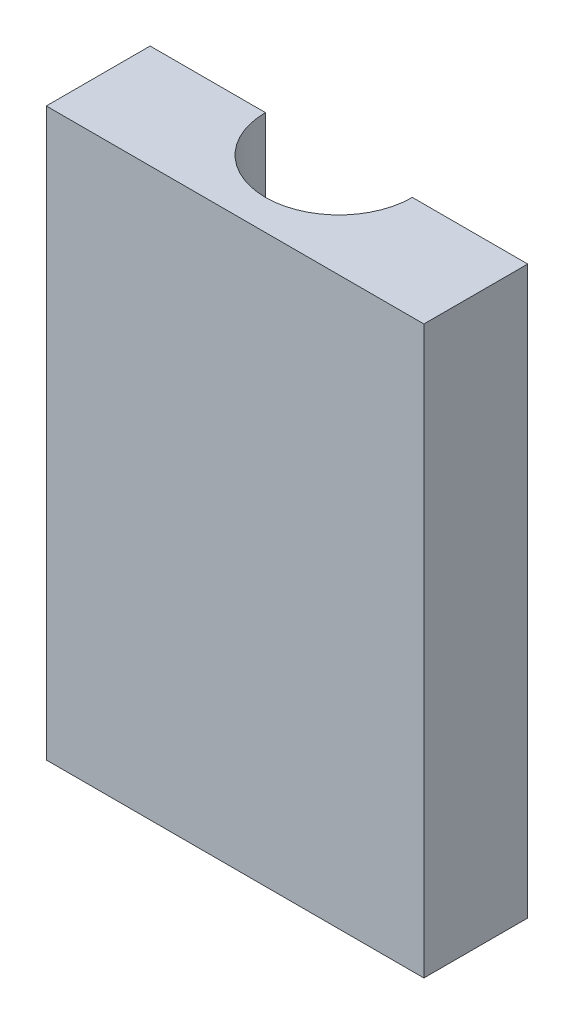
ISO-10303-21;
HEADER;
FILE_DESCRIPTION(('STEP AP214'),'2;1');
FILE_NAME('part.step','',(''),(''),'','','');
FILE_SCHEMA(('AUTOMOTIVE_DESIGN { 1 0 10303 214 1 1 1 1 }'));
ENDSEC;
DATA;
#1=APPLICATION_CONTEXT('core data for automotive mechanical design processes');
#2=APPLICATION_PROTOCOL_DEFINITION('international standard','automotive_design',2000,#1);
#3=PRODUCT_CONTEXT('',#1,'mechanical');
#4=PRODUCT('Part','Part','',(#3));
#5=PRODUCT_RELATED_PRODUCT_CATEGORY('part','',(#4));
#6=PRODUCT_DEFINITION_FORMATION('','',#4);
#7=PRODUCT_DEFINITION_CONTEXT('part definition',#1,'design');
#8=PRODUCT_DEFINITION('design','',#6,#7);
#9=PRODUCT_DEFINITION_SHAPE('','',#8);
#10=(LENGTH_UNIT() NAMED_UNIT(*) SI_UNIT(.MILLI.,.METRE.));
#11=(NAMED_UNIT(*) PLANE_ANGLE_UNIT() SI_UNIT($,.RADIAN.));
#12=(NAMED_UNIT(*) SI_UNIT($,.STERADIAN.) SOLID_ANGLE_UNIT());
#13=UNCERTAINTY_MEASURE_WITH_UNIT(LENGTH_MEASURE(1.E-05),#10,'distance_accuracy_value','');
#14=(GEOMETRIC_REPRESENTATION_CONTEXT(3) GLOBAL_UNCERTAINTY_ASSIGNED_CONTEXT((#13)) GLOBAL_UNIT_ASSIGNED_CONTEXT((#10,
#11,#12)) REPRESENTATION_CONTEXT('',''));
#15=CARTESIAN_POINT('',(0.,0.,0.));
#16=DIRECTION('',(0.,0.,1.));
#17=DIRECTION('',(1.,0.,0.));
#18=AXIS2_PLACEMENT_3D('',#15,#16,#17);
#19=CARTESIAN_POINT('',(-9.8806,12.7,0.));
#20=CARTESIAN_POINT('',(-13.7837333333333,8.46666666666667,0.));
#21=CARTESIAN_POINT('',(-17.6868666666667,4.23333333333333,0.));
#22=CARTESIAN_POINT('',(-21.59,0.,0.));
#23=CARTESIAN_POINT('',(-9.8806,12.7,-0.272662572352311));
#24=CARTESIAN_POINT('',(-13.7837333333333,8.46666666666667,-0.296844728512093));
#25=CARTESIAN_POINT('',(-17.6868666666667,4.23333333333333,-0.321026884671874));
#26=CARTESIAN_POINT('',(-21.59,0.,-0.345209040831655));
#27=CARTESIAN_POINT('',(-9.85846325723523,12.7,-0.812858202586466));
#28=CARTESIAN_POINT('',(-13.7528519132639,8.46666666666667,-0.884949739833852));
#29=CARTESIAN_POINT('',(-17.6472405692925,4.23333333333333,-0.957041277081239));
#30=CARTESIAN_POINT('',(-21.5416292253212,0.,-1.02913281432863));
#31=CARTESIAN_POINT('',(-9.76139899903792,12.7,-1.60521202028217));
#32=CARTESIAN_POINT('',(-13.6174443619826,8.46666666666667,-1.74757658249229));
#33=CARTESIAN_POINT('',(-17.4734897249273,4.23333333333333,-1.8899411447024));
#34=CARTESIAN_POINT('',(-21.329535087872,0.,-2.03230570691252));
#35=CARTESIAN_POINT('',(-9.60302668103459,12.7,-2.3770751260782));
#36=CARTESIAN_POINT('',(-13.3965102285555,8.46666666666667,-2.58789541360956));
#37=CARTESIAN_POINT('',(-17.1899937760765,4.23333333333333,-2.79871570114091));
#38=CARTESIAN_POINT('',(-20.9834773235974,0.,-3.00953598867227));
#39=CARTESIAN_POINT('',(-8.30025091964339,12.7,-6.87000298399141));
#40=CARTESIAN_POINT('',(-11.5790989693054,8.46666666666667,-7.47929630776443));
#41=CARTESIAN_POINT('',(-14.8579470189675,4.23333333333333,-8.08858963153745));
#42=CARTESIAN_POINT('',(-18.1367950686295,0.,-8.69788295531046));
#43=CARTESIAN_POINT('',(-4.36260115763694,12.7,-9.8806));
#44=CARTESIAN_POINT('',(-6.08595945555522,8.46666666666667,-10.7569));
#45=CARTESIAN_POINT('',(-7.8093177534735,4.23333333333333,-11.6332));
#46=CARTESIAN_POINT('',(-9.53267605139178,0.,-12.5095));
#47=CARTESIAN_POINT('',(5.45325144704619,12.7,-9.8806));
#48=CARTESIAN_POINT('',(7.60744931944404,8.46666666666667,-10.7569));
#49=CARTESIAN_POINT('',(9.76164719184189,4.23333333333333,-11.6332));
#50=CARTESIAN_POINT('',(11.9158450642397,0.,-12.5095));
#51=CARTESIAN_POINT('',(9.8806,12.7,-5.45325144704618));
#52=CARTESIAN_POINT('',(13.7837333333333,8.46666666666667,-5.93689457024179));
#53=CARTESIAN_POINT('',(17.6868666666667,4.23333333333333,-6.4205376934374));
#54=CARTESIAN_POINT('',(21.59,0.,-6.90418081663301));
#55=CARTESIAN_POINT('',(9.8806,12.7,5.45325144704619));
#56=CARTESIAN_POINT('',(13.7837333333333,8.46666666666667,5.9368945702418));
#57=CARTESIAN_POINT('',(17.6868666666667,4.23333333333333,6.42053769343741));
#58=CARTESIAN_POINT('',(21.59,0.,6.90418081663303));
#59=CARTESIAN_POINT('',(5.45325144704618,12.7,9.8806));
#60=CARTESIAN_POINT('',(7.60744931944403,8.46666666666667,10.7569));
#61=CARTESIAN_POINT('',(9.76164719184188,4.23333333333333,11.6332));
#62=CARTESIAN_POINT('',(11.9158450642397,0.,12.5095));
#63=CARTESIAN_POINT('',(-4.36260115763695,12.7,9.8806));
#64=CARTESIAN_POINT('',(-6.08595945555523,8.46666666666667,10.7569));
#65=CARTESIAN_POINT('',(-7.80931775347351,4.23333333333333,11.6332));
#66=CARTESIAN_POINT('',(-9.53267605139178,0.,12.5095));
#67=CARTESIAN_POINT('',(-8.30025091964339,12.7,6.8700029839914));
#68=CARTESIAN_POINT('',(-11.5790989693054,8.46666666666667,7.47929630776442));
#69=CARTESIAN_POINT('',(-14.8579470189675,4.23333333333333,8.08858963153743));
#70=CARTESIAN_POINT('',(-18.1367950686295,0.,8.69788295531045));
#71=CARTESIAN_POINT('',(-9.60302668103459,12.7,2.37707512607819));
#72=CARTESIAN_POINT('',(-13.3965102285555,8.46666666666667,2.58789541360955));
#73=CARTESIAN_POINT('',(-17.1899937760765,4.23333333333333,2.7987157011409));
#74=CARTESIAN_POINT('',(-20.9834773235974,0.,3.00953598867226));
#75=CARTESIAN_POINT('',(-9.76139899903792,12.7,1.60521202028217));
#76=CARTESIAN_POINT('',(-13.6174443619826,8.46666666666667,1.74757658249228));
#77=CARTESIAN_POINT('',(-17.4734897249273,4.23333333333333,1.88994114470239));
#78=CARTESIAN_POINT('',(-21.329535087872,0.,2.03230570691251));
#79=CARTESIAN_POINT('',(-9.85846325723523,12.7,0.812858202586462));
#80=CARTESIAN_POINT('',(-13.7528519132639,8.46666666666667,0.884949739833847));
#81=CARTESIAN_POINT('',(-17.6472405692925,4.23333333333333,0.957041277081232));
#82=CARTESIAN_POINT('',(-21.5416292253212,0.,1.02913281432862));
#83=CARTESIAN_POINT('',(-9.8806,12.7,0.272662572352305));
#84=CARTESIAN_POINT('',(-13.7837333333333,8.46666666666667,0.296844728512085));
#85=CARTESIAN_POINT('',(-17.6868666666667,4.23333333333333,0.321026884671864));
#86=CARTESIAN_POINT('',(-21.59,0.,0.345209040831644));
#87=CARTESIAN_POINT('',(-9.8806,12.7,0.));
#88=CARTESIAN_POINT('',(-13.7837333333333,8.46666666666667,0.));
#89=CARTESIAN_POINT('',(-17.6868666666667,4.23333333333333,0.));
#90=CARTESIAN_POINT('',(-21.59,0.,0.));
#91=B_SPLINE_SURFACE_WITH_KNOTS('',3,3,((#19,#20,#21,#22),(#23,#24,#25,#26),(#27,#28,#29,#30),
(#31,#32,#33,#34),(#35,#36,#37,#38),(#39,#40,#41,#42),(#43,#44,#45,#46),(#47,#48,#49,#50),(#51,
#52,#53,#54),(#55,#56,#57,#58),(#59,#60,#61,#62),(#63,#64,#65,#66),(#67,#68,#69,#70),(#71,#72,
#73,#74),(#75,#76,#77,#78),(#79,#80,#81,#82),(#83,#84,#85,#86),(#87,#88,#89,#90)),.UNSPECIFIED.,
.T.,.F.,.F.,(4,1,1,1,1,2,2,2,1,1,1,1,4),(4,4),(0.,0.0125,0.0249999999999999,0.0375000000000001,
0.05,0.25,0.5,0.75,0.95,0.9625,0.975,0.9875,1.),(0.,1.),.UNSPECIFIED.);
#92=CARTESIAN_POINT('',(21.59,0.,0.));
#93=CARTESIAN_POINT('',(19.6384333333333,2.11666666666666,0.));
#94=CARTESIAN_POINT('',(17.6868666666667,4.23333333333333,0.));
#95=CARTESIAN_POINT('',(14.7595166666667,7.40833333333333,0.));
#96=CARTESIAN_POINT('',(13.7837333333333,8.46666666666667,0.));
#97=CARTESIAN_POINT('',(11.8321666666667,10.5833333333333,0.));
#98=CARTESIAN_POINT('',(10.8563833333333,11.6416666666667,0.));
#99=CARTESIAN_POINT('',(9.8806,12.7,0.));
#100=B_SPLINE_CURVE_WITH_KNOTS('',3,(#92,#93,#94,#95,#96,#97,#98,#99),.UNSPECIFIED.,.F.,.F.,(4,
2,2,4),(0.,8.63712985256097,12.9556947788415,17.274259705122),.UNSPECIFIED.);
#101=CARTESIAN_POINT('',(21.59,0.,0.));
#102=VERTEX_POINT('',#101);
#103=CARTESIAN_POINT('',(9.8806,12.7,0.));
#104=VERTEX_POINT('',#103);
#105=EDGE_CURVE('E172',#102,#104,#100,.T.);
#106=CARTESIAN_POINT('',(0.,0.,0.));
#107=DIRECTION('',(0.,1.,0.));
#108=DIRECTION('',(-1.,0.,0.));
#109=AXIS2_PLACEMENT_3D('',#106,#107,#108);
#110=ELLIPSE('',#109,21.59,12.5095);
#111=CARTESIAN_POINT('',(-21.59,0.,0.));
#112=VERTEX_POINT('',#111);
#113=EDGE_CURVE('E243',#112,#102,#110,.T.);
#114=DIRECTION('',(-0.677852492661556,-0.735197931303207,0.));
#115=VECTOR('',#114,1.);
#116=CARTESIAN_POINT('',(-15.7353,6.35,0.));
#117=LINE('',#116,#115);
#118=CARTESIAN_POINT('',(-9.8806,12.7,0.));
#119=VERTEX_POINT('',#118);
#120=EDGE_CURVE('E180',#119,#112,#117,.T.);
#121=CARTESIAN_POINT('',(-9.8806,12.7,0.));
#122=CARTESIAN_POINT('',(-9.8806,12.7,0.272662572352305));
#123=CARTESIAN_POINT('',(-9.85846325723523,12.7,0.812858202586462));
#124=CARTESIAN_POINT('',(-9.76139899903792,12.7,1.60521202028217));
#125=CARTESIAN_POINT('',(-9.60302668103459,12.7,2.37707512607819));
#126=CARTESIAN_POINT('',(-8.30025091964339,12.7,6.8700029839914));
#127=CARTESIAN_POINT('',(-4.36260115763695,12.7,9.8806));
#128=CARTESIAN_POINT('',(5.45325144704618,12.7,9.8806));
#129=CARTESIAN_POINT('',(9.8806,12.7,5.45325144704619));
#130=CARTESIAN_POINT('',(9.8806,12.7,-5.45325144704618));
#131=CARTESIAN_POINT('',(5.45325144704619,12.7,-9.8806));
#132=CARTESIAN_POINT('',(-4.36260115763694,12.7,-9.8806));
#133=CARTESIAN_POINT('',(-8.30025091964339,12.7,-6.87000298399141));
#134=CARTESIAN_POINT('',(-9.60302668103459,12.7,-2.3770751260782));
#135=CARTESIAN_POINT('',(-9.76139899903792,12.7,-1.60521202028217));
#136=CARTESIAN_POINT('',(-9.85846325723523,12.7,-0.812858202586466));
#137=CARTESIAN_POINT('',(-9.8806,12.7,-0.272662572352311));
#138=CARTESIAN_POINT('',(-9.8806,12.7,0.));
#139=B_SPLINE_CURVE_WITH_KNOTS('',3,(#121,#122,#123,#124,#125,#126,#127,#128,#129,#130,#131,
#132,#133,#134,#135,#136,#137,#138),.UNSPECIFIED.,.T.,.F.,(4,1,1,1,1,2,2,2,1,1,1,1,4),(0.,
0.0125,0.025,0.0375,0.05,0.25,0.5,0.75,0.95,0.9625,0.975,0.9875,1.),.UNSPECIFIED.);
#140=EDGE_CURVE('E178',#119,#104,#139,.T.);
#141=CARTESIAN_POINT('',(0.,12.7,-9.8806));
#142=CARTESIAN_POINT('',(0.,8.46666666666666,-10.7569));
#143=CARTESIAN_POINT('',(0.,4.23333333333333,-11.6332));
#144=CARTESIAN_POINT('',(0.,0.,-12.5095));
#145=CARTESIAN_POINT('',(5.45325144704619,12.7,-9.8806));
#146=CARTESIAN_POINT('',(7.60744931944404,8.46666666666667,-10.7569));
#147=CARTESIAN_POINT('',(9.76164719184189,4.23333333333333,-11.6332));
#148=CARTESIAN_POINT('',(11.9158450642397,0.,-12.5095));
#149=CARTESIAN_POINT('',(9.8806,12.7,-5.45325144704618));
#150=CARTESIAN_POINT('',(13.7837333333333,8.46666666666667,-5.93689457024179));
#151=CARTESIAN_POINT('',(17.6868666666667,4.23333333333333,-6.4205376934374));
#152=CARTESIAN_POINT('',(21.59,0.,-6.90418081663301));
#153=CARTESIAN_POINT('',(9.8806,12.7,5.45325144704619));
#154=CARTESIAN_POINT('',(13.7837333333333,8.46666666666667,5.9368945702418));
#155=CARTESIAN_POINT('',(17.6868666666667,4.23333333333333,6.42053769343741));
#156=CARTESIAN_POINT('',(21.59,0.,6.90418081663303));
#157=CARTESIAN_POINT('',(5.45325144704618,12.7,9.8806));
#158=CARTESIAN_POINT('',(7.60744931944403,8.46666666666667,10.7569));
#159=CARTESIAN_POINT('',(9.76164719184188,4.23333333333333,11.6332));
#160=CARTESIAN_POINT('',(11.9158450642397,0.,12.5095));
#161=CARTESIAN_POINT('',(-4.36260115763695,12.7,9.8806));
#162=CARTESIAN_POINT('',(-6.08595945555523,8.46666666666667,10.7569));
#163=CARTESIAN_POINT('',(-7.80931775347351,4.23333333333333,11.6332));
#164=CARTESIAN_POINT('',(-9.53267605139178,0.,12.5095));
#165=CARTESIAN_POINT('',(-8.30025091964339,12.7,6.8700029839914));
#166=CARTESIAN_POINT('',(-11.5790989693054,8.46666666666667,7.47929630776442));
#167=CARTESIAN_POINT('',(-14.8579470189675,4.23333333333333,8.08858963153743));
#168=CARTESIAN_POINT('',(-18.1367950686295,0.,8.69788295531045));
#169=CARTESIAN_POINT('',(-9.60302668103459,12.7,2.37707512607819));
#170=CARTESIAN_POINT('',(-13.3965102285555,8.46666666666667,2.58789541360955));
#171=CARTESIAN_POINT('',(-17.1899937760765,4.23333333333333,2.7987157011409));
#172=CARTESIAN_POINT('',(-20.9834773235974,0.,3.00953598867226));
#173=CARTESIAN_POINT('',(-9.76139899903792,12.7,1.60521202028217));
#174=CARTESIAN_POINT('',(-13.6174443619826,8.46666666666667,1.74757658249228));
#175=CARTESIAN_POINT('',(-17.4734897249273,4.23333333333333,1.88994114470239));
#176=CARTESIAN_POINT('',(-21.329535087872,0.,2.03230570691251));
#177=CARTESIAN_POINT('',(-9.85846325723523,12.7,0.812858202586462));
#178=CARTESIAN_POINT('',(-13.7528519132639,8.46666666666667,0.884949739833847));
#179=CARTESIAN_POINT('',(-17.6472405692925,4.23333333333333,0.957041277081232));
#180=CARTESIAN_POINT('',(-21.5416292253212,0.,1.02913281432862));
#181=CARTESIAN_POINT('',(-9.8806,12.7,0.272662572352305));
#182=CARTESIAN_POINT('',(-13.7837333333333,8.46666666666667,0.296844728512085));
#183=CARTESIAN_POINT('',(-17.6868666666667,4.23333333333333,0.321026884671864));
#184=CARTESIAN_POINT('',(-21.59,0.,0.345209040831644));
#185=CARTESIAN_POINT('',(-9.8806,12.7,0.));
#186=CARTESIAN_POINT('',(-13.7837333333333,8.46666666666667,0.));
#187=CARTESIAN_POINT('',(-17.6868666666667,4.23333333333333,0.));
#188=CARTESIAN_POINT('',(-21.59,0.,0.));
#189=CARTESIAN_POINT('',(-9.8806,12.7,-0.272662572352311));
#190=CARTESIAN_POINT('',(-13.7837333333333,8.46666666666667,-0.296844728512093));
#191=CARTESIAN_POINT('',(-17.6868666666667,4.23333333333333,-0.321026884671874));
#192=CARTESIAN_POINT('',(-21.59,0.,-0.345209040831655));
#193=CARTESIAN_POINT('',(-9.85846325723523,12.7,-0.812858202586466));
#194=CARTESIAN_POINT('',(-13.7528519132639,8.46666666666667,-0.884949739833852));
#195=CARTESIAN_POINT('',(-17.6472405692925,4.23333333333333,-0.957041277081239));
#196=CARTESIAN_POINT('',(-21.5416292253212,0.,-1.02913281432863));
#197=CARTESIAN_POINT('',(-9.76139899903792,12.7,-1.60521202028217));
#198=CARTESIAN_POINT('',(-13.6174443619826,8.46666666666667,-1.74757658249229));
#199=CARTESIAN_POINT('',(-17.4734897249273,4.23333333333333,-1.8899411447024));
#200=CARTESIAN_POINT('',(-21.329535087872,0.,-2.03230570691252));
#201=CARTESIAN_POINT('',(-9.60302668103459,12.7,-2.3770751260782));
#202=CARTESIAN_POINT('',(-13.3965102285555,8.46666666666667,-2.58789541360956));
#203=CARTESIAN_POINT('',(-17.1899937760765,4.23333333333333,-2.79871570114091));
#204=CARTESIAN_POINT('',(-20.9834773235974,0.,-3.00953598867227));
#205=CARTESIAN_POINT('',(-8.30025091964339,12.7,-6.87000298399141));
#206=CARTESIAN_POINT('',(-11.5790989693054,8.46666666666667,-7.47929630776443));
#207=CARTESIAN_POINT('',(-14.8579470189675,4.23333333333333,-8.08858963153745));
#208=CARTESIAN_POINT('',(-18.1367950686295,0.,-8.69788295531046));
#209=CARTESIAN_POINT('',(-4.36260115763694,12.7,-9.8806));
#210=CARTESIAN_POINT('',(-6.08595945555522,8.46666666666667,-10.7569));
#211=CARTESIAN_POINT('',(-7.8093177534735,4.23333333333333,-11.6332));
#212=CARTESIAN_POINT('',(-9.53267605139178,0.,-12.5095));
#213=CARTESIAN_POINT('',(0.,12.7,-9.8806));
#214=CARTESIAN_POINT('',(0.,8.46666666666666,-10.7569));
#215=CARTESIAN_POINT('',(0.,4.23333333333333,-11.6332));
#216=CARTESIAN_POINT('',(0.,0.,-12.5095));
#217=B_SPLINE_SURFACE_WITH_KNOTS('',3,3,((#141,#142,#143,#144),(#145,#146,#147,#148),(#149,#150,
#151,#152),(#153,#154,#155,#156),(#157,#158,#159,#160),(#161,#162,#163,#164),(#165,#166,#167,
#168),(#169,#170,#171,#172),(#173,#174,#175,#176),(#177,#178,#179,#180),(#181,#182,#183,#184),
(#185,#186,#187,#188),(#189,#190,#191,#192),(#193,#194,#195,#196),(#197,#198,#199,#200),(#201,
#202,#203,#204),(#205,#206,#207,#208),(#209,#210,#211,#212),(#213,#214,#215,#216)),
.UNSPECIFIED.,.T.,.F.,.F.,(4,2,2,1,1,1,1,3,1,1,1,1,4),(4,4),(0.25,0.5,0.75,0.95,0.9625,0.975,
0.9875,1.,1.0125,1.025,1.0375,1.05,1.25),(0.,1.),.UNSPECIFIED.);
#218=ORIENTED_EDGE('',*,*,#105,.F.);
#219=ORIENTED_EDGE('',*,*,#113,.F.);
#220=ORIENTED_EDGE('',*,*,#120,.F.);
#221=ORIENTED_EDGE('',*,*,#140,.T.);
#222=EDGE_LOOP('',(#218,#219,#220,#221));
#223=FACE_BOUND('',#222,.T.);
#224=ADVANCED_FACE('F59',(#223),#217,.F.);
#225=CARTESIAN_POINT('',(25.4,-50.8,13.97));
#226=DIRECTION('',(-1.,0.,0.));
#227=DIRECTION('',(0.,0.,1.));
#228=AXIS2_PLACEMENT_3D('',#225,#226,#227);
#229=PLANE('',#228);
#230=DIRECTION('',(0.,-1.,0.));
#231=VECTOR('',#230,1.);
#232=CARTESIAN_POINT('',(25.4,0.,0.));
#233=LINE('',#232,#231);
#234=CARTESIAN_POINT('',(25.4,25.4,0.));
#235=VERTEX_POINT('',#234);
#236=CARTESIAN_POINT('',(25.4,-50.8,0.));
#237=VERTEX_POINT('',#236);
#238=EDGE_CURVE('E157',#235,#237,#233,.T.);
#239=ORIENTED_EDGE('',*,*,#238,.F.);
#240=DIRECTION('',(0.,0.,-1.));
#241=VECTOR('',#240,1.);
#242=CARTESIAN_POINT('',(25.4,25.4,13.97));
#243=LINE('',#242,#241);
#244=CARTESIAN_POINT('',(25.4,25.4,13.97));
#245=VERTEX_POINT('',#244);
#246=EDGE_CURVE('E76',#245,#235,#243,.T.);
#247=ORIENTED_EDGE('',*,*,#246,.F.);
#248=DIRECTION('',(0.,1.,0.));
#249=VECTOR('',#248,1.);
#250=CARTESIAN_POINT('',(25.4,-50.8,13.97));
#251=LINE('',#250,#249);
#252=CARTESIAN_POINT('',(25.4,-50.8,13.97));
#253=VERTEX_POINT('',#252);
#254=EDGE_CURVE('E142',#253,#245,#251,.T.);
#255=ORIENTED_EDGE('',*,*,#254,.F.);
#256=DIRECTION('',(0.,0.,-1.));
#257=VECTOR('',#256,1.);
#258=CARTESIAN_POINT('',(25.4,-50.8,13.97));
#259=LINE('',#258,#257);
#260=EDGE_CURVE('E69',#253,#237,#259,.T.);
#261=ORIENTED_EDGE('',*,*,#260,.T.);
#262=EDGE_LOOP('',(#239,#247,#255,#261));
#263=FACE_BOUND('',#262,.T.);
#264=ADVANCED_FACE('F61',(#263),#229,.F.);
#265=CARTESIAN_POINT('',(-25.4,-50.8,13.97));
#266=DIRECTION('',(1.,0.,0.));
#267=DIRECTION('',(0.,0.,-1.));
#268=AXIS2_PLACEMENT_3D('',#265,#266,#267);
#269=PLANE('',#268);
#270=DIRECTION('',(0.,-1.,0.));
#271=VECTOR('',#270,1.);
#272=CARTESIAN_POINT('',(-25.4,-50.8,13.97));
#273=LINE('',#272,#271);
#274=CARTESIAN_POINT('',(-25.4,25.4,13.97));
#275=VERTEX_POINT('',#274);
#276=CARTESIAN_POINT('',(-25.4,-50.8,13.97));
#277=VERTEX_POINT('',#276);
#278=EDGE_CURVE('E139',#275,#277,#273,.T.);
#279=ORIENTED_EDGE('',*,*,#278,.F.);
#280=DIRECTION('',(0.,0.,1.));
#281=VECTOR('',#280,1.);
#282=CARTESIAN_POINT('',(-25.4,25.4,13.97));
#283=LINE('',#282,#281);
#284=CARTESIAN_POINT('',(-25.4,25.4,0.));
#285=VERTEX_POINT('',#284);
#286=EDGE_CURVE('E125',#285,#275,#283,.T.);
#287=ORIENTED_EDGE('',*,*,#286,.F.);
#288=DIRECTION('',(0.,1.,0.));
#289=VECTOR('',#288,1.);
#290=CARTESIAN_POINT('',(-25.4,0.,0.));
#291=LINE('',#290,#289);
#292=CARTESIAN_POINT('',(-25.4,-50.8,0.));
#293=VERTEX_POINT('',#292);
#294=EDGE_CURVE('E175',#293,#285,#291,.T.);
#295=ORIENTED_EDGE('',*,*,#294,.F.);
#296=DIRECTION('',(0.,0.,-1.));
#297=VECTOR('',#296,1.);
#298=CARTESIAN_POINT('',(-25.4,-50.8,13.97));
#299=LINE('',#298,#297);
#300=EDGE_CURVE('E13',#277,#293,#299,.T.);
#301=ORIENTED_EDGE('',*,*,#300,.F.);
#302=EDGE_LOOP('',(#279,#287,#295,#301));
#303=FACE_BOUND('',#302,.T.);
#304=ADVANCED_FACE('F144',(#303),#269,.F.);
#305=CARTESIAN_POINT('',(-25.4,-50.8,13.97));
#306=DIRECTION('',(0.,1.,0.));
#307=DIRECTION('',(0.,0.,1.));
#308=AXIS2_PLACEMENT_3D('',#305,#306,#307);
#309=PLANE('',#308);
#310=CARTESIAN_POINT('',(0.,-50.8,0.));
#311=DIRECTION('',(0.,1.,0.));
#312=DIRECTION('',(-1.,0.,0.));
#313=AXIS2_PLACEMENT_3D('',#310,#311,#312);
#314=ELLIPSE('',#313,21.59,12.5095);
#315=CARTESIAN_POINT('',(-21.59,-50.8,0.));
#316=VERTEX_POINT('',#315);
#317=CARTESIAN_POINT('',(21.59,-50.8,0.));
#318=VERTEX_POINT('',#317);
#319=EDGE_CURVE('E149',#316,#318,#314,.T.);
#320=ORIENTED_EDGE('',*,*,#319,.T.);
#321=DIRECTION('',(-1.,0.,0.));
#322=VECTOR('',#321,1.);
#323=CARTESIAN_POINT('',(0.,-50.8,0.));
#324=LINE('',#323,#322);
#325=EDGE_CURVE('E162',#237,#318,#324,.T.);
#326=ORIENTED_EDGE('',*,*,#325,.F.);
#327=ORIENTED_EDGE('',*,*,#260,.F.);
#328=DIRECTION('',(1.,0.,0.));
#329=VECTOR('',#328,1.);
#330=CARTESIAN_POINT('',(-25.4,-50.8,13.97));
#331=LINE('',#330,#329);
#332=EDGE_CURVE('E146',#277,#253,#331,.T.);
#333=ORIENTED_EDGE('',*,*,#332,.F.);
#334=ORIENTED_EDGE('',*,*,#300,.T.);
#335=EDGE_CURVE('E169',#316,#293,#324,.T.);
#336=ORIENTED_EDGE('',*,*,#335,.F.);
#337=EDGE_LOOP('',(#320,#326,#327,#333,#334,#336));
#338=FACE_BOUND('',#337,.T.);
#339=ADVANCED_FACE('F161',(#338),#309,.F.);
#340=CARTESIAN_POINT('',(0.,0.,13.97));
#341=DIRECTION('',(0.,0.,-1.));
#342=DIRECTION('',(-1.,0.,0.));
#343=AXIS2_PLACEMENT_3D('',#340,#341,#342);
#344=PLANE('',#343);
#345=ORIENTED_EDGE('',*,*,#254,.T.);
#346=DIRECTION('',(1.,0.,0.));
#347=VECTOR('',#346,1.);
#348=CARTESIAN_POINT('',(-25.4,25.4,13.97));
#349=LINE('',#348,#347);
#350=EDGE_CURVE('E128',#275,#245,#349,.T.);
#351=ORIENTED_EDGE('',*,*,#350,.F.);
#352=ORIENTED_EDGE('',*,*,#278,.T.);
#353=ORIENTED_EDGE('',*,*,#332,.T.);
#354=EDGE_LOOP('',(#345,#351,#352,#353));
#355=FACE_BOUND('',#354,.T.);
#356=ADVANCED_FACE('F138',(#355),#344,.F.);
#357=DIRECTION('',(0.,1.,0.));
#358=VECTOR('',#357,1.);
#359=SURFACE_OF_LINEAR_EXTRUSION('',#314,#358);
#360=ORIENTED_EDGE('',*,*,#113,.T.);
#361=DIRECTION('',(0.,1.,0.));
#362=VECTOR('',#361,1.);
#363=CARTESIAN_POINT('',(21.59,-50.8,0.));
#364=LINE('',#363,#362);
#365=EDGE_CURVE('E167',#318,#102,#364,.T.);
#366=ORIENTED_EDGE('',*,*,#365,.F.);
#367=ORIENTED_EDGE('',*,*,#319,.F.);
#368=DIRECTION('',(0.,1.,0.));
#369=VECTOR('',#368,1.);
#370=CARTESIAN_POINT('',(-21.59,-50.8,0.));
#371=LINE('',#370,#369);
#372=EDGE_CURVE('E176',#112,#316,#371,.F.);
#373=ORIENTED_EDGE('',*,*,#372,.F.);
#374=EDGE_LOOP('',(#360,#366,#367,#373));
#375=FACE_BOUND('',#374,.T.);
#376=ADVANCED_FACE('F209',(#375),#359,.F.);
#377=CARTESIAN_POINT('',(0.,50.8,0.));
#378=DIRECTION('',(0.,-1.,0.));
#379=DIRECTION('',(0.,0.,-1.));
#380=AXIS2_PLACEMENT_3D('',#377,#378,#379);
#381=CYLINDRICAL_SURFACE('',#380,9.8806);
#382=CARTESIAN_POINT('',(0.,25.4,0.));
#383=DIRECTION('',(0.,-1.,0.));
#384=DIRECTION('',(0.,0.,-1.));
#385=AXIS2_PLACEMENT_3D('',#382,#383,#384);
#386=CIRCLE('',#385,9.8806);
#387=CARTESIAN_POINT('',(9.8806,25.4,0.));
#388=VERTEX_POINT('',#387);
#389=CARTESIAN_POINT('',(-9.8806,25.4,0.));
#390=VERTEX_POINT('',#389);
#391=EDGE_CURVE('E253',#388,#390,#386,.T.);
#392=ORIENTED_EDGE('',*,*,#391,.F.);
#393=DIRECTION('',(0.,-1.,0.));
#394=VECTOR('',#393,1.);
#395=CARTESIAN_POINT('',(9.8806,50.8,0.));
#396=LINE('',#395,#394);
#397=EDGE_CURVE('E63',#388,#104,#396,.T.);
#398=ORIENTED_EDGE('',*,*,#397,.T.);
#399=ORIENTED_EDGE('',*,*,#140,.F.);
#400=DIRECTION('',(0.,-1.,0.));
#401=VECTOR('',#400,1.);
#402=CARTESIAN_POINT('',(-9.8806,50.8,0.));
#403=LINE('',#402,#401);
#404=EDGE_CURVE('E170',#119,#390,#403,.F.);
#405=ORIENTED_EDGE('',*,*,#404,.T.);
#406=EDGE_LOOP('',(#392,#398,#399,#405));
#407=FACE_BOUND('',#406,.T.);
#408=ADVANCED_FACE('F198',(#407),#381,.F.);
#409=CARTESIAN_POINT('',(0.,0.,0.));
#410=DIRECTION('',(0.,0.,1.));
#411=DIRECTION('',(1.,0.,0.));
#412=AXIS2_PLACEMENT_3D('',#409,#410,#411);
#413=PLANE('',#412);
#414=ORIENTED_EDGE('',*,*,#294,.T.);
#415=DIRECTION('',(-1.,0.,0.));
#416=VECTOR('',#415,1.);
#417=CARTESIAN_POINT('',(-25.4,25.4,0.));
#418=LINE('',#417,#416);
#419=EDGE_CURVE('E130',#390,#285,#418,.T.);
#420=ORIENTED_EDGE('',*,*,#419,.F.);
#421=ORIENTED_EDGE('',*,*,#404,.F.);
#422=ORIENTED_EDGE('',*,*,#120,.T.);
#423=ORIENTED_EDGE('',*,*,#372,.T.);
#424=ORIENTED_EDGE('',*,*,#335,.T.);
#425=EDGE_LOOP('',(#414,#420,#421,#422,#423,#424));
#426=FACE_BOUND('',#425,.T.);
#427=ADVANCED_FACE('F208',(#426),#413,.F.);
#428=ORIENTED_EDGE('',*,*,#397,.F.);
#429=EDGE_CURVE('E339',#235,#388,#418,.T.);
#430=ORIENTED_EDGE('',*,*,#429,.F.);
#431=ORIENTED_EDGE('',*,*,#238,.T.);
#432=ORIENTED_EDGE('',*,*,#325,.T.);
#433=ORIENTED_EDGE('',*,*,#365,.T.);
#434=ORIENTED_EDGE('',*,*,#105,.T.);
#435=EDGE_LOOP('',(#428,#430,#431,#432,#433,#434));
#436=FACE_BOUND('',#435,.T.);
#437=ADVANCED_FACE('F251',(#436),#413,.F.);
#438=CARTESIAN_POINT('',(0.,25.4,0.));
#439=DIRECTION('',(0.,-1.,0.));
#440=DIRECTION('',(0.,0.,-1.));
#441=AXIS2_PLACEMENT_3D('',#438,#439,#440);
#442=PLANE('',#441);
#443=ORIENTED_EDGE('',*,*,#391,.T.);
#444=ORIENTED_EDGE('',*,*,#419,.T.);
#445=ORIENTED_EDGE('',*,*,#286,.T.);
#446=ORIENTED_EDGE('',*,*,#350,.T.);
#447=ORIENTED_EDGE('',*,*,#246,.T.);
#448=ORIENTED_EDGE('',*,*,#429,.T.);
#449=EDGE_LOOP('',(#443,#444,#445,#446,#447,#448));
#450=FACE_BOUND('',#449,.T.);
#451=ADVANCED_FACE('F127',(#450),#442,.F.);
#452=CLOSED_SHELL('',(#224,#264,#304,#339,#356,#376,#408,#427,#437,#451));
#453=MANIFOLD_SOLID_BREP('B2',#452);
#454=ADVANCED_BREP_SHAPE_REPRESENTATION('',(#18,#453),#14);
#455=SHAPE_DEFINITION_REPRESENTATION(#9,#454);
ENDSEC;
END-ISO-10303-21;
